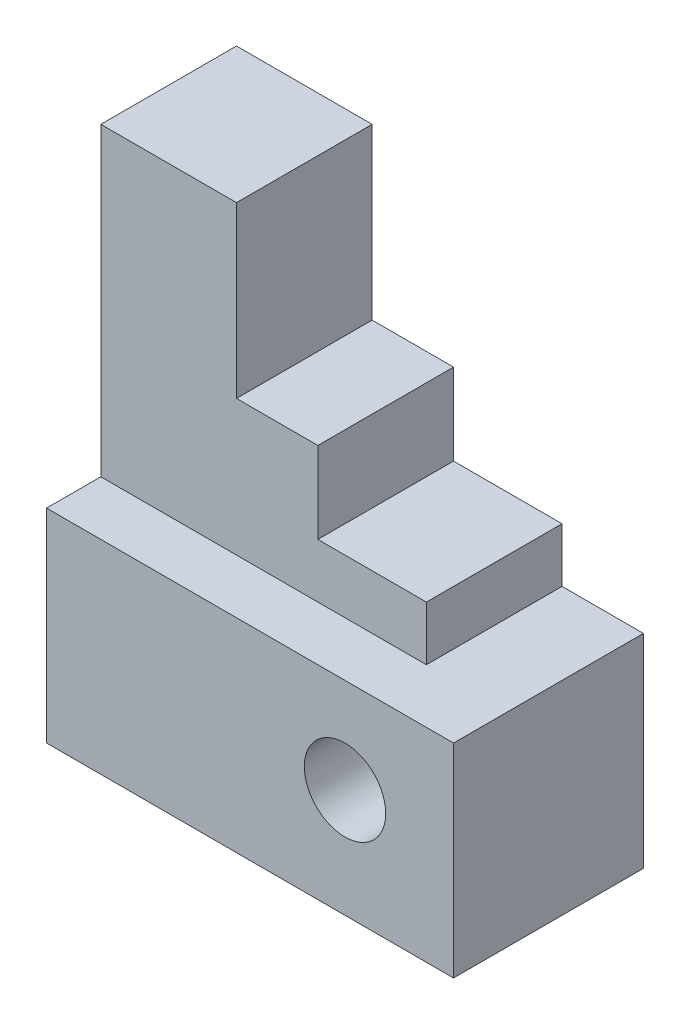
ISO-10303-21;
HEADER;
FILE_DESCRIPTION(('STEP AP214'),'2;1');
FILE_NAME('part.step','',(''),(''),'','','');
FILE_SCHEMA(('AUTOMOTIVE_DESIGN { 1 0 10303 214 1 1 1 1 }'));
ENDSEC;
DATA;
#1=APPLICATION_CONTEXT('core data for automotive mechanical design processes');
#2=APPLICATION_PROTOCOL_DEFINITION('international standard','automotive_design',2000,#1);
#3=PRODUCT_CONTEXT('',#1,'mechanical');
#4=PRODUCT('Part','Part','',(#3));
#5=PRODUCT_RELATED_PRODUCT_CATEGORY('part','',(#4));
#6=PRODUCT_DEFINITION_FORMATION('','',#4);
#7=PRODUCT_DEFINITION_CONTEXT('part definition',#1,'design');
#8=PRODUCT_DEFINITION('design','',#6,#7);
#9=PRODUCT_DEFINITION_SHAPE('','',#8);
#10=(LENGTH_UNIT() NAMED_UNIT(*) SI_UNIT(.MILLI.,.METRE.));
#11=(NAMED_UNIT(*) PLANE_ANGLE_UNIT() SI_UNIT($,.RADIAN.));
#12=(NAMED_UNIT(*) SI_UNIT($,.STERADIAN.) SOLID_ANGLE_UNIT());
#13=UNCERTAINTY_MEASURE_WITH_UNIT(LENGTH_MEASURE(1.E-05),#10,'distance_accuracy_value','');
#14=(GEOMETRIC_REPRESENTATION_CONTEXT(3) GLOBAL_UNCERTAINTY_ASSIGNED_CONTEXT((#13)) GLOBAL_UNIT_ASSIGNED_CONTEXT((#10,
#11,#12)) REPRESENTATION_CONTEXT('',''));
#15=CARTESIAN_POINT('',(0.,0.,0.));
#16=DIRECTION('',(0.,0.,1.));
#17=DIRECTION('',(1.,0.,0.));
#18=AXIS2_PLACEMENT_3D('',#15,#16,#17);
#19=CARTESIAN_POINT('',(48.,0.,20.));
#20=DIRECTION('',(1.,0.,0.));
#21=DIRECTION('',(0.,0.,-1.));
#22=AXIS2_PLACEMENT_3D('',#19,#20,#21);
#23=PLANE('',#22);
#24=DIRECTION('',(0.,-1.,0.));
#25=VECTOR('',#24,1.);
#26=CARTESIAN_POINT('',(48.,0.,0.));
#27=LINE('',#26,#25);
#28=CARTESIAN_POINT('',(48.,38.,0.));
#29=VERTEX_POINT('',#28);
#30=CARTESIAN_POINT('',(48.,30.,0.));
#31=VERTEX_POINT('',#30);
#32=EDGE_CURVE('E216',#29,#31,#27,.T.);
#33=ORIENTED_EDGE('',*,*,#32,.F.);
#34=DIRECTION('',(0.,0.,-1.));
#35=VECTOR('',#34,1.);
#36=CARTESIAN_POINT('',(48.,38.,20.));
#37=LINE('',#36,#35);
#38=CARTESIAN_POINT('',(48.,38.,20.));
#39=VERTEX_POINT('',#38);
#40=EDGE_CURVE('E59',#39,#29,#37,.T.);
#41=ORIENTED_EDGE('',*,*,#40,.F.);
#42=DIRECTION('',(0.,-1.,0.));
#43=VECTOR('',#42,1.);
#44=CARTESIAN_POINT('',(48.,0.,20.));
#45=LINE('',#44,#43);
#46=CARTESIAN_POINT('',(48.,30.,20.));
#47=VERTEX_POINT('',#46);
#48=EDGE_CURVE('E185',#39,#47,#45,.T.);
#49=ORIENTED_EDGE('',*,*,#48,.T.);
#50=DIRECTION('',(0.,0.,-1.));
#51=VECTOR('',#50,1.);
#52=CARTESIAN_POINT('',(48.,30.,20.));
#53=LINE('',#52,#51);
#54=EDGE_CURVE('E116',#47,#31,#53,.T.);
#55=ORIENTED_EDGE('',*,*,#54,.T.);
#56=EDGE_LOOP('',(#33,#41,#49,#55));
#57=FACE_BOUND('',#56,.T.);
#58=ADVANCED_FACE('F56',(#57),#23,.T.);
#59=CARTESIAN_POINT('',(0.,38.,20.));
#60=DIRECTION('',(0.,1.,0.));
#61=DIRECTION('',(-1.,0.,0.));
#62=AXIS2_PLACEMENT_3D('',#59,#60,#61);
#63=PLANE('',#62);
#64=DIRECTION('',(1.,0.,0.));
#65=VECTOR('',#64,1.);
#66=CARTESIAN_POINT('',(0.,38.,0.));
#67=LINE('',#66,#65);
#68=CARTESIAN_POINT('',(32.,38.,0.));
#69=VERTEX_POINT('',#68);
#70=EDGE_CURVE('E212',#69,#29,#67,.T.);
#71=ORIENTED_EDGE('',*,*,#70,.F.);
#72=DIRECTION('',(0.,0.,-1.));
#73=VECTOR('',#72,1.);
#74=CARTESIAN_POINT('',(32.,38.,20.));
#75=LINE('',#74,#73);
#76=CARTESIAN_POINT('',(32.,38.,20.));
#77=VERTEX_POINT('',#76);
#78=EDGE_CURVE('E202',#77,#69,#75,.T.);
#79=ORIENTED_EDGE('',*,*,#78,.F.);
#80=DIRECTION('',(1.,0.,0.));
#81=VECTOR('',#80,1.);
#82=CARTESIAN_POINT('',(0.,38.,20.));
#83=LINE('',#82,#81);
#84=EDGE_CURVE('E215',#77,#39,#83,.T.);
#85=ORIENTED_EDGE('',*,*,#84,.T.);
#86=ORIENTED_EDGE('',*,*,#40,.T.);
#87=EDGE_LOOP('',(#71,#79,#85,#86));
#88=FACE_BOUND('',#87,.T.);
#89=ADVANCED_FACE('F210',(#88),#63,.T.);
#90=CARTESIAN_POINT('',(32.,0.,20.));
#91=DIRECTION('',(1.,0.,0.));
#92=DIRECTION('',(0.,0.,-1.));
#93=AXIS2_PLACEMENT_3D('',#90,#91,#92);
#94=PLANE('',#93);
#95=DIRECTION('',(0.,-1.,0.));
#96=VECTOR('',#95,1.);
#97=CARTESIAN_POINT('',(32.,0.,0.));
#98=LINE('',#97,#96);
#99=CARTESIAN_POINT('',(32.,50.,0.));
#100=VERTEX_POINT('',#99);
#101=EDGE_CURVE('E222',#100,#69,#98,.T.);
#102=ORIENTED_EDGE('',*,*,#101,.F.);
#103=DIRECTION('',(0.,0.,-1.));
#104=VECTOR('',#103,1.);
#105=CARTESIAN_POINT('',(32.,50.,20.));
#106=LINE('',#105,#104);
#107=CARTESIAN_POINT('',(32.,50.,20.));
#108=VERTEX_POINT('',#107);
#109=EDGE_CURVE('E198',#108,#100,#106,.T.);
#110=ORIENTED_EDGE('',*,*,#109,.F.);
#111=DIRECTION('',(0.,-1.,0.));
#112=VECTOR('',#111,1.);
#113=CARTESIAN_POINT('',(32.,0.,20.));
#114=LINE('',#113,#112);
#115=EDGE_CURVE('E291',#108,#77,#114,.T.);
#116=ORIENTED_EDGE('',*,*,#115,.T.);
#117=ORIENTED_EDGE('',*,*,#78,.T.);
#118=EDGE_LOOP('',(#102,#110,#116,#117));
#119=FACE_BOUND('',#118,.T.);
#120=ADVANCED_FACE('F296',(#119),#94,.T.);
#121=CARTESIAN_POINT('',(0.,50.,20.));
#122=DIRECTION('',(0.,1.,0.));
#123=DIRECTION('',(-1.,0.,0.));
#124=AXIS2_PLACEMENT_3D('',#121,#122,#123);
#125=PLANE('',#124);
#126=DIRECTION('',(1.,0.,0.));
#127=VECTOR('',#126,1.);
#128=CARTESIAN_POINT('',(0.,50.,0.));
#129=LINE('',#128,#127);
#130=CARTESIAN_POINT('',(20.,50.,0.));
#131=VERTEX_POINT('',#130);
#132=EDGE_CURVE('E223',#131,#100,#129,.T.);
#133=ORIENTED_EDGE('',*,*,#132,.F.);
#134=DIRECTION('',(0.,0.,-1.));
#135=VECTOR('',#134,1.);
#136=CARTESIAN_POINT('',(20.,50.,20.));
#137=LINE('',#136,#135);
#138=CARTESIAN_POINT('',(20.,50.,20.));
#139=VERTEX_POINT('',#138);
#140=EDGE_CURVE('E146',#139,#131,#137,.T.);
#141=ORIENTED_EDGE('',*,*,#140,.F.);
#142=DIRECTION('',(1.,0.,0.));
#143=VECTOR('',#142,1.);
#144=CARTESIAN_POINT('',(0.,50.,20.));
#145=LINE('',#144,#143);
#146=EDGE_CURVE('E154',#139,#108,#145,.T.);
#147=ORIENTED_EDGE('',*,*,#146,.T.);
#148=ORIENTED_EDGE('',*,*,#109,.T.);
#149=EDGE_LOOP('',(#133,#141,#147,#148));
#150=FACE_BOUND('',#149,.T.);
#151=ADVANCED_FACE('F298',(#150),#125,.T.);
#152=CARTESIAN_POINT('',(20.,0.,20.));
#153=DIRECTION('',(1.,0.,0.));
#154=DIRECTION('',(0.,1.,0.));
#155=AXIS2_PLACEMENT_3D('',#152,#153,#154);
#156=PLANE('',#155);
#157=DIRECTION('',(0.,-1.,0.));
#158=VECTOR('',#157,1.);
#159=CARTESIAN_POINT('',(20.,0.,0.));
#160=LINE('',#159,#158);
#161=CARTESIAN_POINT('',(20.,75.,0.));
#162=VERTEX_POINT('',#161);
#163=EDGE_CURVE('E141',#162,#131,#160,.T.);
#164=ORIENTED_EDGE('',*,*,#163,.F.);
#165=DIRECTION('',(0.,0.,-1.));
#166=VECTOR('',#165,1.);
#167=CARTESIAN_POINT('',(20.,75.,20.));
#168=LINE('',#167,#166);
#169=CARTESIAN_POINT('',(20.,75.,20.));
#170=VERTEX_POINT('',#169);
#171=EDGE_CURVE('E136',#170,#162,#168,.T.);
#172=ORIENTED_EDGE('',*,*,#171,.F.);
#173=DIRECTION('',(0.,-1.,0.));
#174=VECTOR('',#173,1.);
#175=CARTESIAN_POINT('',(20.,0.,20.));
#176=LINE('',#175,#174);
#177=EDGE_CURVE('E139',#170,#139,#176,.T.);
#178=ORIENTED_EDGE('',*,*,#177,.T.);
#179=ORIENTED_EDGE('',*,*,#140,.T.);
#180=EDGE_LOOP('',(#164,#172,#178,#179));
#181=FACE_BOUND('',#180,.T.);
#182=ADVANCED_FACE('F138',(#181),#156,.T.);
#183=CARTESIAN_POINT('',(0.,75.,20.));
#184=DIRECTION('',(0.,1.,0.));
#185=DIRECTION('',(0.,0.,1.));
#186=AXIS2_PLACEMENT_3D('',#183,#184,#185);
#187=PLANE('',#186);
#188=DIRECTION('',(1.,0.,0.));
#189=VECTOR('',#188,1.);
#190=CARTESIAN_POINT('',(0.,75.,0.));
#191=LINE('',#190,#189);
#192=CARTESIAN_POINT('',(0.,75.,0.));
#193=VERTEX_POINT('',#192);
#194=EDGE_CURVE('E237',#193,#162,#191,.T.);
#195=ORIENTED_EDGE('',*,*,#194,.F.);
#196=DIRECTION('',(0.,0.,-1.));
#197=VECTOR('',#196,1.);
#198=CARTESIAN_POINT('',(0.,75.,20.));
#199=LINE('',#198,#197);
#200=CARTESIAN_POINT('',(0.,75.,20.));
#201=VERTEX_POINT('',#200);
#202=EDGE_CURVE('E147',#201,#193,#199,.T.);
#203=ORIENTED_EDGE('',*,*,#202,.F.);
#204=DIRECTION('',(1.,0.,0.));
#205=VECTOR('',#204,1.);
#206=CARTESIAN_POINT('',(0.,75.,20.));
#207=LINE('',#206,#205);
#208=EDGE_CURVE('E151',#201,#170,#207,.T.);
#209=ORIENTED_EDGE('',*,*,#208,.T.);
#210=ORIENTED_EDGE('',*,*,#171,.T.);
#211=EDGE_LOOP('',(#195,#203,#209,#210));
#212=FACE_BOUND('',#211,.T.);
#213=ADVANCED_FACE('F157',(#212),#187,.T.);
#214=CARTESIAN_POINT('',(0.,0.,20.));
#215=DIRECTION('',(-1.,0.,0.));
#216=DIRECTION('',(0.,0.,1.));
#217=AXIS2_PLACEMENT_3D('',#214,#215,#216);
#218=PLANE('',#217);
#219=DIRECTION('',(0.,1.,0.));
#220=VECTOR('',#219,1.);
#221=CARTESIAN_POINT('',(0.,0.,0.));
#222=LINE('',#221,#220);
#223=CARTESIAN_POINT('',(0.,0.,0.));
#224=VERTEX_POINT('',#223);
#225=EDGE_CURVE('E240',#224,#193,#222,.T.);
#226=ORIENTED_EDGE('',*,*,#225,.F.);
#227=DIRECTION('',(0.,0.,-1.));
#228=VECTOR('',#227,1.);
#229=CARTESIAN_POINT('',(0.,0.,20.));
#230=LINE('',#229,#228);
#231=CARTESIAN_POINT('',(0.,0.,28.));
#232=VERTEX_POINT('',#231);
#233=EDGE_CURVE('E275',#232,#224,#230,.T.);
#234=ORIENTED_EDGE('',*,*,#233,.F.);
#235=DIRECTION('',(0.,-1.,0.));
#236=VECTOR('',#235,1.);
#237=CARTESIAN_POINT('',(0.,0.,28.));
#238=LINE('',#237,#236);
#239=CARTESIAN_POINT('',(0.,30.,28.));
#240=VERTEX_POINT('',#239);
#241=EDGE_CURVE('E254',#240,#232,#238,.T.);
#242=ORIENTED_EDGE('',*,*,#241,.F.);
#243=DIRECTION('',(0.,0.,-1.));
#244=VECTOR('',#243,1.);
#245=CARTESIAN_POINT('',(0.,30.,28.));
#246=LINE('',#245,#244);
#247=CARTESIAN_POINT('',(0.,30.,20.));
#248=VERTEX_POINT('',#247);
#249=EDGE_CURVE('E218',#240,#248,#246,.T.);
#250=ORIENTED_EDGE('',*,*,#249,.T.);
#251=DIRECTION('',(0.,1.,0.));
#252=VECTOR('',#251,1.);
#253=CARTESIAN_POINT('',(0.,0.,20.));
#254=LINE('',#253,#252);
#255=EDGE_CURVE('E158',#248,#201,#254,.T.);
#256=ORIENTED_EDGE('',*,*,#255,.T.);
#257=ORIENTED_EDGE('',*,*,#202,.T.);
#258=EDGE_LOOP('',(#226,#234,#242,#250,#256,#257));
#259=FACE_BOUND('',#258,.T.);
#260=ADVANCED_FACE('F305',(#259),#218,.T.);
#261=CARTESIAN_POINT('',(0.,0.,20.));
#262=DIRECTION('',(0.,-1.,0.));
#263=DIRECTION('',(1.,0.,0.));
#264=AXIS2_PLACEMENT_3D('',#261,#262,#263);
#265=PLANE('',#264);
#266=DIRECTION('',(-1.,0.,0.));
#267=VECTOR('',#266,1.);
#268=CARTESIAN_POINT('',(0.,0.,0.));
#269=LINE('',#268,#267);
#270=CARTESIAN_POINT('',(60.,0.,0.));
#271=VERTEX_POINT('',#270);
#272=EDGE_CURVE('E243',#271,#224,#269,.T.);
#273=ORIENTED_EDGE('',*,*,#272,.F.);
#274=DIRECTION('',(0.,0.,-1.));
#275=VECTOR('',#274,1.);
#276=CARTESIAN_POINT('',(60.,0.,20.));
#277=LINE('',#276,#275);
#278=CARTESIAN_POINT('',(60.,0.,28.));
#279=VERTEX_POINT('',#278);
#280=EDGE_CURVE('E273',#279,#271,#277,.T.);
#281=ORIENTED_EDGE('',*,*,#280,.F.);
#282=DIRECTION('',(1.,0.,0.));
#283=VECTOR('',#282,1.);
#284=CARTESIAN_POINT('',(0.,0.,28.));
#285=LINE('',#284,#283);
#286=EDGE_CURVE('E259',#232,#279,#285,.T.);
#287=ORIENTED_EDGE('',*,*,#286,.F.);
#288=ORIENTED_EDGE('',*,*,#233,.T.);
#289=EDGE_LOOP('',(#273,#281,#287,#288));
#290=FACE_BOUND('',#289,.T.);
#291=ADVANCED_FACE('F319',(#290),#265,.T.);
#292=CARTESIAN_POINT('',(60.,0.,20.));
#293=DIRECTION('',(1.,0.,0.));
#294=DIRECTION('',(0.,1.,0.));
#295=AXIS2_PLACEMENT_3D('',#292,#293,#294);
#296=PLANE('',#295);
#297=DIRECTION('',(0.,-1.,0.));
#298=VECTOR('',#297,1.);
#299=CARTESIAN_POINT('',(60.,0.,0.));
#300=LINE('',#299,#298);
#301=CARTESIAN_POINT('',(60.,30.,0.));
#302=VERTEX_POINT('',#301);
#303=EDGE_CURVE('E180',#302,#271,#300,.T.);
#304=ORIENTED_EDGE('',*,*,#303,.F.);
#305=DIRECTION('',(0.,0.,-1.));
#306=VECTOR('',#305,1.);
#307=CARTESIAN_POINT('',(60.,30.,20.));
#308=LINE('',#307,#306);
#309=CARTESIAN_POINT('',(60.,30.,28.));
#310=VERTEX_POINT('',#309);
#311=EDGE_CURVE('E109',#310,#302,#308,.T.);
#312=ORIENTED_EDGE('',*,*,#311,.F.);
#313=DIRECTION('',(0.,1.,0.));
#314=VECTOR('',#313,1.);
#315=CARTESIAN_POINT('',(60.,0.,28.));
#316=LINE('',#315,#314);
#317=EDGE_CURVE('E266',#279,#310,#316,.T.);
#318=ORIENTED_EDGE('',*,*,#317,.F.);
#319=ORIENTED_EDGE('',*,*,#280,.T.);
#320=EDGE_LOOP('',(#304,#312,#318,#319));
#321=FACE_BOUND('',#320,.T.);
#322=ADVANCED_FACE('F312',(#321),#296,.T.);
#323=CARTESIAN_POINT('',(0.,30.,20.));
#324=DIRECTION('',(0.,1.,0.));
#325=DIRECTION('',(0.,0.,1.));
#326=AXIS2_PLACEMENT_3D('',#323,#324,#325);
#327=PLANE('',#326);
#328=DIRECTION('',(1.,0.,0.));
#329=VECTOR('',#328,1.);
#330=CARTESIAN_POINT('',(0.,30.,0.));
#331=LINE('',#330,#329);
#332=EDGE_CURVE('E174',#31,#302,#331,.T.);
#333=ORIENTED_EDGE('',*,*,#332,.F.);
#334=ORIENTED_EDGE('',*,*,#54,.F.);
#335=DIRECTION('',(-1.,0.,0.));
#336=VECTOR('',#335,1.);
#337=CARTESIAN_POINT('',(0.,30.,20.));
#338=LINE('',#337,#336);
#339=EDGE_CURVE('E13',#47,#248,#338,.T.);
#340=ORIENTED_EDGE('',*,*,#339,.T.);
#341=ORIENTED_EDGE('',*,*,#249,.F.);
#342=DIRECTION('',(-1.,0.,0.));
#343=VECTOR('',#342,1.);
#344=CARTESIAN_POINT('',(0.,30.,28.));
#345=LINE('',#344,#343);
#346=EDGE_CURVE('E260',#310,#240,#345,.T.);
#347=ORIENTED_EDGE('',*,*,#346,.F.);
#348=ORIENTED_EDGE('',*,*,#311,.T.);
#349=EDGE_LOOP('',(#333,#334,#340,#341,#347,#348));
#350=FACE_BOUND('',#349,.T.);
#351=ADVANCED_FACE('F310',(#350),#327,.T.);
#352=CARTESIAN_POINT('',(44.,16.,20.));
#353=DIRECTION('',(0.,0.,-1.));
#354=DIRECTION('',(-1.,0.,0.));
#355=AXIS2_PLACEMENT_3D('',#352,#353,#354);
#356=CYLINDRICAL_SURFACE('',#355,6.);
#357=CARTESIAN_POINT('',(44.,16.,0.));
#358=DIRECTION('',(0.,0.,1.));
#359=DIRECTION('',(1.,0.,0.));
#360=AXIS2_PLACEMENT_3D('',#357,#358,#359);
#361=CIRCLE('',#360,6.);
#362=CARTESIAN_POINT('',(50.,16.,0.));
#363=VERTEX_POINT('',#362);
#364=EDGE_CURVE('E179',#363,#363,#361,.T.);
#365=ORIENTED_EDGE('',*,*,#364,.F.);
#366=EDGE_LOOP('',(#365));
#367=FACE_BOUND('',#366,.T.);
#368=CARTESIAN_POINT('',(44.,16.,28.));
#369=DIRECTION('',(0.,0.,1.));
#370=DIRECTION('',(1.,0.,0.));
#371=AXIS2_PLACEMENT_3D('',#368,#369,#370);
#372=CIRCLE('',#371,6.);
#373=CARTESIAN_POINT('',(50.,16.,28.));
#374=VERTEX_POINT('',#373);
#375=EDGE_CURVE('E327',#374,#374,#372,.T.);
#376=ORIENTED_EDGE('',*,*,#375,.T.);
#377=EDGE_LOOP('',(#376));
#378=FACE_BOUND('',#377,.T.);
#379=ADVANCED_FACE('F333',(#367,#378),#356,.F.);
#380=CARTESIAN_POINT('',(0.,0.,20.));
#381=DIRECTION('',(0.,0.,1.));
#382=DIRECTION('',(1.,0.,0.));
#383=AXIS2_PLACEMENT_3D('',#380,#381,#382);
#384=PLANE('',#383);
#385=ORIENTED_EDGE('',*,*,#339,.F.);
#386=ORIENTED_EDGE('',*,*,#48,.F.);
#387=ORIENTED_EDGE('',*,*,#84,.F.);
#388=ORIENTED_EDGE('',*,*,#115,.F.);
#389=ORIENTED_EDGE('',*,*,#146,.F.);
#390=ORIENTED_EDGE('',*,*,#177,.F.);
#391=ORIENTED_EDGE('',*,*,#208,.F.);
#392=ORIENTED_EDGE('',*,*,#255,.F.);
#393=EDGE_LOOP('',(#385,#386,#387,#388,#389,#390,#391,#392));
#394=FACE_BOUND('',#393,.T.);
#395=ADVANCED_FACE('F150',(#394),#384,.T.);
#396=CARTESIAN_POINT('',(0.,0.,0.));
#397=DIRECTION('',(0.,0.,1.));
#398=DIRECTION('',(1.,0.,0.));
#399=AXIS2_PLACEMENT_3D('',#396,#397,#398);
#400=PLANE('',#399);
#401=ORIENTED_EDGE('',*,*,#32,.T.);
#402=ORIENTED_EDGE('',*,*,#332,.T.);
#403=ORIENTED_EDGE('',*,*,#303,.T.);
#404=ORIENTED_EDGE('',*,*,#272,.T.);
#405=ORIENTED_EDGE('',*,*,#225,.T.);
#406=ORIENTED_EDGE('',*,*,#194,.T.);
#407=ORIENTED_EDGE('',*,*,#163,.T.);
#408=ORIENTED_EDGE('',*,*,#132,.T.);
#409=ORIENTED_EDGE('',*,*,#101,.T.);
#410=ORIENTED_EDGE('',*,*,#70,.T.);
#411=EDGE_LOOP('',(#401,#402,#403,#404,#405,#406,#407,#408,#409,#410));
#412=FACE_BOUND('',#411,.T.);
#413=ORIENTED_EDGE('',*,*,#364,.T.);
#414=EDGE_LOOP('',(#413));
#415=FACE_BOUND('',#414,.T.);
#416=ADVANCED_FACE('F219',(#412,#415),#400,.F.);
#417=CARTESIAN_POINT('',(0.,0.,28.));
#418=DIRECTION('',(0.,0.,1.));
#419=DIRECTION('',(1.,0.,0.));
#420=AXIS2_PLACEMENT_3D('',#417,#418,#419);
#421=PLANE('',#420);
#422=ORIENTED_EDGE('',*,*,#346,.T.);
#423=ORIENTED_EDGE('',*,*,#241,.T.);
#424=ORIENTED_EDGE('',*,*,#286,.T.);
#425=ORIENTED_EDGE('',*,*,#317,.T.);
#426=EDGE_LOOP('',(#422,#423,#424,#425));
#427=FACE_BOUND('',#426,.T.);
#428=ORIENTED_EDGE('',*,*,#375,.F.);
#429=EDGE_LOOP('',(#428));
#430=FACE_BOUND('',#429,.T.);
#431=ADVANCED_FACE('F323',(#427,#430),#421,.T.);
#432=CLOSED_SHELL('',(#58,#89,#120,#151,#182,#213,#260,#291,#322,#351,#379,#395,#416,#431));
#433=MANIFOLD_SOLID_BREP('B2',#432);
#434=ADVANCED_BREP_SHAPE_REPRESENTATION('',(#18,#433),#14);
#435=SHAPE_DEFINITION_REPRESENTATION(#9,#434);
ENDSEC;
END-ISO-10303-21;
